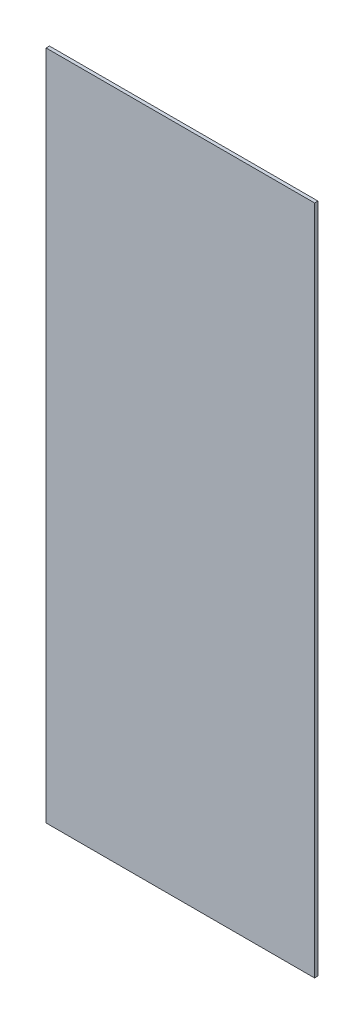
ISO-10303-21;
HEADER;
FILE_DESCRIPTION(('STEP AP214'),'2;1');
FILE_NAME('part.step','',(''),(''),'','','');
FILE_SCHEMA(('AUTOMOTIVE_DESIGN { 1 0 10303 214 1 1 1 1 }'));
ENDSEC;
DATA;
#1=APPLICATION_CONTEXT('core data for automotive mechanical design processes');
#2=APPLICATION_PROTOCOL_DEFINITION('international standard','automotive_design',2000,#1);
#3=PRODUCT_CONTEXT('',#1,'mechanical');
#4=PRODUCT('Part','Part','',(#3));
#5=PRODUCT_RELATED_PRODUCT_CATEGORY('part','',(#4));
#6=PRODUCT_DEFINITION_FORMATION('','',#4);
#7=PRODUCT_DEFINITION_CONTEXT('part definition',#1,'design');
#8=PRODUCT_DEFINITION('design','',#6,#7);
#9=PRODUCT_DEFINITION_SHAPE('','',#8);
#10=(LENGTH_UNIT() NAMED_UNIT(*) SI_UNIT(.MILLI.,.METRE.));
#11=(NAMED_UNIT(*) PLANE_ANGLE_UNIT() SI_UNIT($,.RADIAN.));
#12=(NAMED_UNIT(*) SI_UNIT($,.STERADIAN.) SOLID_ANGLE_UNIT());
#13=UNCERTAINTY_MEASURE_WITH_UNIT(LENGTH_MEASURE(1.E-05),#10,'distance_accuracy_value','');
#14=(GEOMETRIC_REPRESENTATION_CONTEXT(3) GLOBAL_UNCERTAINTY_ASSIGNED_CONTEXT((#13)) GLOBAL_UNIT_ASSIGNED_CONTEXT((#10,
#11,#12)) REPRESENTATION_CONTEXT('',''));
#15=CARTESIAN_POINT('',(0.,0.,0.));
#16=DIRECTION('',(0.,0.,1.));
#17=DIRECTION('',(1.,0.,0.));
#18=AXIS2_PLACEMENT_3D('',#15,#16,#17);
#19=CARTESIAN_POINT('',(80.,-200.,2.));
#20=DIRECTION('',(-1.,0.,0.));
#21=DIRECTION('',(0.,0.,1.));
#22=AXIS2_PLACEMENT_3D('',#19,#20,#21);
#23=PLANE('',#22);
#24=DIRECTION('',(0.,1.,0.));
#25=VECTOR('',#24,1.);
#26=CARTESIAN_POINT('',(80.,-200.,0.));
#27=LINE('',#26,#25);
#28=CARTESIAN_POINT('',(80.,-200.,0.));
#29=VERTEX_POINT('',#28);
#30=CARTESIAN_POINT('',(80.,200.,0.));
#31=VERTEX_POINT('',#30);
#32=EDGE_CURVE('E96',#29,#31,#27,.T.);
#33=ORIENTED_EDGE('',*,*,#32,.T.);
#34=DIRECTION('',(0.,0.,-1.));
#35=VECTOR('',#34,1.);
#36=CARTESIAN_POINT('',(80.,200.,2.));
#37=LINE('',#36,#35);
#38=CARTESIAN_POINT('',(80.,200.,2.));
#39=VERTEX_POINT('',#38);
#40=EDGE_CURVE('E11',#39,#31,#37,.T.);
#41=ORIENTED_EDGE('',*,*,#40,.F.);
#42=DIRECTION('',(0.,1.,0.));
#43=VECTOR('',#42,1.);
#44=CARTESIAN_POINT('',(80.,-200.,2.));
#45=LINE('',#44,#43);
#46=CARTESIAN_POINT('',(80.,-200.,2.));
#47=VERTEX_POINT('',#46);
#48=EDGE_CURVE('E84',#47,#39,#45,.T.);
#49=ORIENTED_EDGE('',*,*,#48,.F.);
#50=DIRECTION('',(0.,0.,-1.));
#51=VECTOR('',#50,1.);
#52=CARTESIAN_POINT('',(80.,-200.,2.));
#53=LINE('',#52,#51);
#54=EDGE_CURVE('E92',#47,#29,#53,.T.);
#55=ORIENTED_EDGE('',*,*,#54,.T.);
#56=EDGE_LOOP('',(#33,#41,#49,#55));
#57=FACE_BOUND('',#56,.T.);
#58=ADVANCED_FACE('F33',(#57),#23,.F.);
#59=CARTESIAN_POINT('',(-80.,200.,2.));
#60=DIRECTION('',(0.,-1.,0.));
#61=DIRECTION('',(0.,0.,-1.));
#62=AXIS2_PLACEMENT_3D('',#59,#60,#61);
#63=PLANE('',#62);
#64=DIRECTION('',(-1.,0.,0.));
#65=VECTOR('',#64,1.);
#66=CARTESIAN_POINT('',(-80.,200.,0.));
#67=LINE('',#66,#65);
#68=CARTESIAN_POINT('',(-80.,200.,0.));
#69=VERTEX_POINT('',#68);
#70=EDGE_CURVE('E88',#31,#69,#67,.T.);
#71=ORIENTED_EDGE('',*,*,#70,.T.);
#72=DIRECTION('',(0.,0.,-1.));
#73=VECTOR('',#72,1.);
#74=CARTESIAN_POINT('',(-80.,200.,2.));
#75=LINE('',#74,#73);
#76=CARTESIAN_POINT('',(-80.,200.,2.));
#77=VERTEX_POINT('',#76);
#78=EDGE_CURVE('E41',#77,#69,#75,.T.);
#79=ORIENTED_EDGE('',*,*,#78,.F.);
#80=DIRECTION('',(-1.,0.,0.));
#81=VECTOR('',#80,1.);
#82=CARTESIAN_POINT('',(-80.,200.,2.));
#83=LINE('',#82,#81);
#84=EDGE_CURVE('E79',#39,#77,#83,.T.);
#85=ORIENTED_EDGE('',*,*,#84,.F.);
#86=ORIENTED_EDGE('',*,*,#40,.T.);
#87=EDGE_LOOP('',(#71,#79,#85,#86));
#88=FACE_BOUND('',#87,.T.);
#89=ADVANCED_FACE('F87',(#88),#63,.F.);
#90=CARTESIAN_POINT('',(-80.,-200.,2.));
#91=DIRECTION('',(1.,0.,0.));
#92=DIRECTION('',(0.,0.,-1.));
#93=AXIS2_PLACEMENT_3D('',#90,#91,#92);
#94=PLANE('',#93);
#95=DIRECTION('',(0.,-1.,0.));
#96=VECTOR('',#95,1.);
#97=CARTESIAN_POINT('',(-80.,-200.,0.));
#98=LINE('',#97,#96);
#99=CARTESIAN_POINT('',(-80.,-200.,0.));
#100=VERTEX_POINT('',#99);
#101=EDGE_CURVE('E66',#69,#100,#98,.T.);
#102=ORIENTED_EDGE('',*,*,#101,.T.);
#103=DIRECTION('',(0.,0.,-1.));
#104=VECTOR('',#103,1.);
#105=CARTESIAN_POINT('',(-80.,-200.,2.));
#106=LINE('',#105,#104);
#107=CARTESIAN_POINT('',(-80.,-200.,2.));
#108=VERTEX_POINT('',#107);
#109=EDGE_CURVE('E89',#108,#100,#106,.T.);
#110=ORIENTED_EDGE('',*,*,#109,.F.);
#111=DIRECTION('',(0.,-1.,0.));
#112=VECTOR('',#111,1.);
#113=CARTESIAN_POINT('',(-80.,-200.,2.));
#114=LINE('',#113,#112);
#115=EDGE_CURVE('E82',#77,#108,#114,.T.);
#116=ORIENTED_EDGE('',*,*,#115,.F.);
#117=ORIENTED_EDGE('',*,*,#78,.T.);
#118=EDGE_LOOP('',(#102,#110,#116,#117));
#119=FACE_BOUND('',#118,.T.);
#120=ADVANCED_FACE('F90',(#119),#94,.F.);
#121=CARTESIAN_POINT('',(-80.,-200.,2.));
#122=DIRECTION('',(0.,1.,0.));
#123=DIRECTION('',(0.,0.,1.));
#124=AXIS2_PLACEMENT_3D('',#121,#122,#123);
#125=PLANE('',#124);
#126=DIRECTION('',(1.,0.,0.));
#127=VECTOR('',#126,1.);
#128=CARTESIAN_POINT('',(-80.,-200.,0.));
#129=LINE('',#128,#127);
#130=EDGE_CURVE('E72',#100,#29,#129,.T.);
#131=ORIENTED_EDGE('',*,*,#130,.T.);
#132=ORIENTED_EDGE('',*,*,#54,.F.);
#133=DIRECTION('',(1.,0.,0.));
#134=VECTOR('',#133,1.);
#135=CARTESIAN_POINT('',(-80.,-200.,2.));
#136=LINE('',#135,#134);
#137=EDGE_CURVE('E49',#108,#47,#136,.T.);
#138=ORIENTED_EDGE('',*,*,#137,.F.);
#139=ORIENTED_EDGE('',*,*,#109,.T.);
#140=EDGE_LOOP('',(#131,#132,#138,#139));
#141=FACE_BOUND('',#140,.T.);
#142=ADVANCED_FACE('F103',(#141),#125,.F.);
#143=CARTESIAN_POINT('',(0.,0.,2.));
#144=DIRECTION('',(0.,0.,-1.));
#145=DIRECTION('',(-1.,0.,0.));
#146=AXIS2_PLACEMENT_3D('',#143,#144,#145);
#147=PLANE('',#146);
#148=ORIENTED_EDGE('',*,*,#48,.T.);
#149=ORIENTED_EDGE('',*,*,#84,.T.);
#150=ORIENTED_EDGE('',*,*,#115,.T.);
#151=ORIENTED_EDGE('',*,*,#137,.T.);
#152=EDGE_LOOP('',(#148,#149,#150,#151));
#153=FACE_BOUND('',#152,.T.);
#154=ADVANCED_FACE('F80',(#153),#147,.F.);
#155=CARTESIAN_POINT('',(0.,0.,0.));
#156=DIRECTION('',(0.,0.,-1.));
#157=DIRECTION('',(-1.,0.,0.));
#158=AXIS2_PLACEMENT_3D('',#155,#156,#157);
#159=PLANE('',#158);
#160=ORIENTED_EDGE('',*,*,#32,.F.);
#161=ORIENTED_EDGE('',*,*,#130,.F.);
#162=ORIENTED_EDGE('',*,*,#101,.F.);
#163=ORIENTED_EDGE('',*,*,#70,.F.);
#164=EDGE_LOOP('',(#160,#161,#162,#163));
#165=FACE_BOUND('',#164,.T.);
#166=ADVANCED_FACE('F106',(#165),#159,.T.);
#167=CLOSED_SHELL('',(#58,#89,#120,#142,#154,#166));
#168=MANIFOLD_SOLID_BREP('B2',#167);
#169=ADVANCED_BREP_SHAPE_REPRESENTATION('',(#18,#168),#14);
#170=SHAPE_DEFINITION_REPRESENTATION(#9,#169);
ENDSEC;
END-ISO-10303-21;
